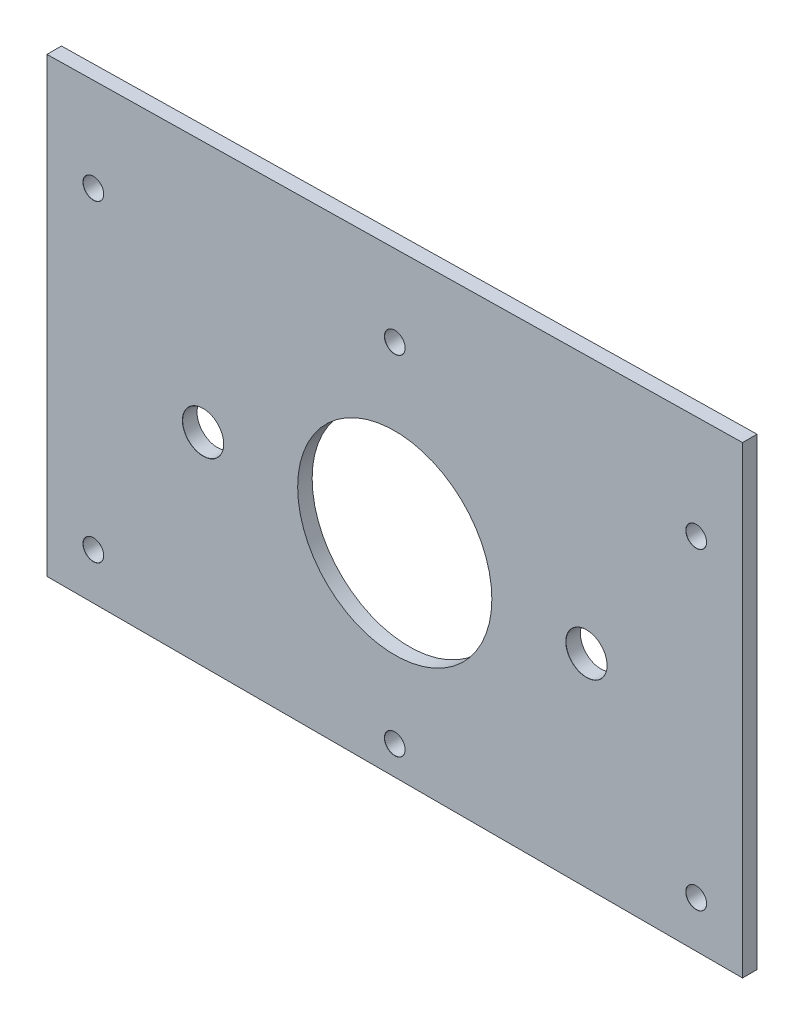
ISO-10303-21;
HEADER;
FILE_DESCRIPTION(('STEP AP214'),'2;1');
FILE_NAME('part.step','',(''),(''),'','','');
FILE_SCHEMA(('AUTOMOTIVE_DESIGN { 1 0 10303 214 1 1 1 1 }'));
ENDSEC;
DATA;
#1=APPLICATION_CONTEXT('core data for automotive mechanical design processes');
#2=APPLICATION_PROTOCOL_DEFINITION('international standard','automotive_design',2000,#1);
#3=PRODUCT_CONTEXT('',#1,'mechanical');
#4=PRODUCT('Part','Part','',(#3));
#5=PRODUCT_RELATED_PRODUCT_CATEGORY('part','',(#4));
#6=PRODUCT_DEFINITION_FORMATION('','',#4);
#7=PRODUCT_DEFINITION_CONTEXT('part definition',#1,'design');
#8=PRODUCT_DEFINITION('design','',#6,#7);
#9=PRODUCT_DEFINITION_SHAPE('','',#8);
#10=(LENGTH_UNIT() NAMED_UNIT(*) SI_UNIT(.MILLI.,.METRE.));
#11=(NAMED_UNIT(*) PLANE_ANGLE_UNIT() SI_UNIT($,.RADIAN.));
#12=(NAMED_UNIT(*) SI_UNIT($,.STERADIAN.) SOLID_ANGLE_UNIT());
#13=UNCERTAINTY_MEASURE_WITH_UNIT(LENGTH_MEASURE(1.E-05),#10,'distance_accuracy_value','');
#14=(GEOMETRIC_REPRESENTATION_CONTEXT(3) GLOBAL_UNCERTAINTY_ASSIGNED_CONTEXT((#13)) GLOBAL_UNIT_ASSIGNED_CONTEXT((#10,
#11,#12)) REPRESENTATION_CONTEXT('',''));
#15=CARTESIAN_POINT('',(0.,0.,0.));
#16=DIRECTION('',(0.,0.,1.));
#17=DIRECTION('',(1.,0.,0.));
#18=AXIS2_PLACEMENT_3D('',#15,#16,#17);
#19=CARTESIAN_POINT('',(76.2,44.45,3.175));
#20=DIRECTION('',(-1.,0.,0.));
#21=DIRECTION('',(0.,0.,1.));
#22=AXIS2_PLACEMENT_3D('',#19,#20,#21);
#23=PLANE('',#22);
#24=DIRECTION('',(0.,1.,0.));
#25=VECTOR('',#24,1.);
#26=CARTESIAN_POINT('',(76.2,44.45,0.));
#27=LINE('',#26,#25);
#28=CARTESIAN_POINT('',(76.2,-44.45,0.));
#29=VERTEX_POINT('',#28);
#30=CARTESIAN_POINT('',(76.2,57.15,0.));
#31=VERTEX_POINT('',#30);
#32=EDGE_CURVE('E74',#29,#31,#27,.T.);
#33=ORIENTED_EDGE('',*,*,#32,.T.);
#34=DIRECTION('',(0.,0.,-1.));
#35=VECTOR('',#34,1.);
#36=CARTESIAN_POINT('',(76.2,57.15,3.175));
#37=LINE('',#36,#35);
#38=CARTESIAN_POINT('',(76.2,57.15,3.175));
#39=VERTEX_POINT('',#38);
#40=EDGE_CURVE('E11',#39,#31,#37,.T.);
#41=ORIENTED_EDGE('',*,*,#40,.F.);
#42=DIRECTION('',(0.,1.,0.));
#43=VECTOR('',#42,1.);
#44=CARTESIAN_POINT('',(76.2,44.45,3.175));
#45=LINE('',#44,#43);
#46=CARTESIAN_POINT('',(76.2,-44.45,3.175));
#47=VERTEX_POINT('',#46);
#48=EDGE_CURVE('E79',#47,#39,#45,.T.);
#49=ORIENTED_EDGE('',*,*,#48,.F.);
#50=DIRECTION('',(0.,0.,-1.));
#51=VECTOR('',#50,1.);
#52=CARTESIAN_POINT('',(76.2,-44.45,3.175));
#53=LINE('',#52,#51);
#54=EDGE_CURVE('E95',#47,#29,#53,.T.);
#55=ORIENTED_EDGE('',*,*,#54,.T.);
#56=EDGE_LOOP('',(#33,#41,#49,#55));
#57=FACE_BOUND('',#56,.T.);
#58=ADVANCED_FACE('F35',(#57),#23,.F.);
#59=CARTESIAN_POINT('',(-76.2,54.61,3.175));
#60=DIRECTION('',(0.0166643523339933,-0.9998611400396,0.));
#61=DIRECTION('',(0.9998611400396,0.0166643523339933,0.));
#62=AXIS2_PLACEMENT_3D('',#59,#60,#61);
#63=PLANE('',#62);
#64=DIRECTION('',(-0.9998611400396,-0.0166643523339933,0.));
#65=VECTOR('',#64,1.);
#66=CARTESIAN_POINT('',(-76.2,54.61,0.));
#67=LINE('',#66,#65);
#68=CARTESIAN_POINT('',(-76.2,54.61,0.));
#69=VERTEX_POINT('',#68);
#70=EDGE_CURVE('E91',#31,#69,#67,.T.);
#71=ORIENTED_EDGE('',*,*,#70,.T.);
#72=DIRECTION('',(0.,0.,-1.));
#73=VECTOR('',#72,1.);
#74=CARTESIAN_POINT('',(-76.2,54.61,3.175));
#75=LINE('',#74,#73);
#76=CARTESIAN_POINT('',(-76.2,54.61,3.175));
#77=VERTEX_POINT('',#76);
#78=EDGE_CURVE('E43',#77,#69,#75,.T.);
#79=ORIENTED_EDGE('',*,*,#78,.F.);
#80=DIRECTION('',(-0.9998611400396,-0.0166643523339933,0.));
#81=VECTOR('',#80,1.);
#82=CARTESIAN_POINT('',(-76.2,54.61,3.175));
#83=LINE('',#82,#81);
#84=EDGE_CURVE('E82',#39,#77,#83,.T.);
#85=ORIENTED_EDGE('',*,*,#84,.F.);
#86=ORIENTED_EDGE('',*,*,#40,.T.);
#87=EDGE_LOOP('',(#71,#79,#85,#86));
#88=FACE_BOUND('',#87,.T.);
#89=ADVANCED_FACE('F90',(#88),#63,.F.);
#90=CARTESIAN_POINT('',(-76.2,44.45,3.175));
#91=DIRECTION('',(1.,0.,0.));
#92=DIRECTION('',(0.,0.,-1.));
#93=AXIS2_PLACEMENT_3D('',#90,#91,#92);
#94=PLANE('',#93);
#95=DIRECTION('',(0.,-1.,0.));
#96=VECTOR('',#95,1.);
#97=CARTESIAN_POINT('',(-76.2,44.45,0.));
#98=LINE('',#97,#96);
#99=CARTESIAN_POINT('',(-76.2,-44.45,0.));
#100=VERTEX_POINT('',#99);
#101=EDGE_CURVE('E67',#69,#100,#98,.T.);
#102=ORIENTED_EDGE('',*,*,#101,.T.);
#103=DIRECTION('',(0.,0.,-1.));
#104=VECTOR('',#103,1.);
#105=CARTESIAN_POINT('',(-76.2,-44.45,3.175));
#106=LINE('',#105,#104);
#107=CARTESIAN_POINT('',(-76.2,-44.45,3.175));
#108=VERTEX_POINT('',#107);
#109=EDGE_CURVE('E92',#108,#100,#106,.T.);
#110=ORIENTED_EDGE('',*,*,#109,.F.);
#111=DIRECTION('',(0.,-1.,0.));
#112=VECTOR('',#111,1.);
#113=CARTESIAN_POINT('',(-76.2,54.61,3.175));
#114=LINE('',#113,#112);
#115=EDGE_CURVE('E86',#77,#108,#114,.T.);
#116=ORIENTED_EDGE('',*,*,#115,.F.);
#117=ORIENTED_EDGE('',*,*,#78,.T.);
#118=EDGE_LOOP('',(#102,#110,#116,#117));
#119=FACE_BOUND('',#118,.T.);
#120=ADVANCED_FACE('F93',(#119),#94,.F.);
#121=CARTESIAN_POINT('',(-76.2,-44.45,3.175));
#122=DIRECTION('',(0.,1.,0.));
#123=DIRECTION('',(0.,0.,1.));
#124=AXIS2_PLACEMENT_3D('',#121,#122,#123);
#125=PLANE('',#124);
#126=DIRECTION('',(1.,0.,0.));
#127=VECTOR('',#126,1.);
#128=CARTESIAN_POINT('',(-76.2,-44.45,0.));
#129=LINE('',#128,#127);
#130=EDGE_CURVE('E103',#100,#29,#129,.T.);
#131=ORIENTED_EDGE('',*,*,#130,.T.);
#132=ORIENTED_EDGE('',*,*,#54,.F.);
#133=DIRECTION('',(1.,0.,0.));
#134=VECTOR('',#133,1.);
#135=CARTESIAN_POINT('',(-76.2,-44.45,3.175));
#136=LINE('',#135,#134);
#137=EDGE_CURVE('E51',#108,#47,#136,.T.);
#138=ORIENTED_EDGE('',*,*,#137,.F.);
#139=ORIENTED_EDGE('',*,*,#109,.T.);
#140=EDGE_LOOP('',(#131,#132,#138,#139));
#141=FACE_BOUND('',#140,.T.);
#142=ADVANCED_FACE('F108',(#141),#125,.F.);
#143=CARTESIAN_POINT('',(0.,0.,3.175));
#144=DIRECTION('',(0.,0.,1.));
#145=DIRECTION('',(1.,0.,0.));
#146=AXIS2_PLACEMENT_3D('',#143,#144,#145);
#147=PLANE('',#146);
#148=CARTESIAN_POINT('',(0.,0.,3.175));
#149=DIRECTION('',(0.,0.,1.));
#150=DIRECTION('',(1.,0.,0.));
#151=AXIS2_PLACEMENT_3D('',#148,#149,#150);
#152=CIRCLE('',#151,21.275);
#153=CARTESIAN_POINT('',(21.275,0.,3.175));
#154=VERTEX_POINT('',#153);
#155=EDGE_CURVE('E204',#154,#154,#152,.T.);
#156=ORIENTED_EDGE('',*,*,#155,.F.);
#157=EDGE_LOOP('',(#156));
#158=FACE_BOUND('',#157,.T.);
#159=CARTESIAN_POINT('',(-42.,0.,3.175));
#160=DIRECTION('',(0.,0.,1.));
#161=DIRECTION('',(1.,0.,0.));
#162=AXIS2_PLACEMENT_3D('',#159,#160,#161);
#163=CIRCLE('',#162,4.525);
#164=CARTESIAN_POINT('',(-37.475,0.,3.175));
#165=VERTEX_POINT('',#164);
#166=EDGE_CURVE('E200',#165,#165,#163,.T.);
#167=ORIENTED_EDGE('',*,*,#166,.F.);
#168=EDGE_LOOP('',(#167));
#169=FACE_BOUND('',#168,.T.);
#170=CARTESIAN_POINT('',(42.,0.,3.175));
#171=DIRECTION('',(0.,0.,1.));
#172=DIRECTION('',(1.,0.,0.));
#173=AXIS2_PLACEMENT_3D('',#170,#171,#172);
#174=CIRCLE('',#173,4.525);
#175=CARTESIAN_POINT('',(46.525,0.,3.175));
#176=VERTEX_POINT('',#175);
#177=EDGE_CURVE('E191',#176,#176,#174,.T.);
#178=ORIENTED_EDGE('',*,*,#177,.F.);
#179=EDGE_LOOP('',(#178));
#180=FACE_BOUND('',#179,.T.);
#181=CARTESIAN_POINT('',(-66.04,34.29,3.175));
#182=DIRECTION('',(0.,0.,1.));
#183=DIRECTION('',(1.,0.,0.));
#184=AXIS2_PLACEMENT_3D('',#181,#182,#183);
#185=CIRCLE('',#184,2.275);
#186=CARTESIAN_POINT('',(-63.765,34.29,3.175));
#187=VERTEX_POINT('',#186);
#188=EDGE_CURVE('E182',#187,#187,#185,.T.);
#189=ORIENTED_EDGE('',*,*,#188,.F.);
#190=EDGE_LOOP('',(#189));
#191=FACE_BOUND('',#190,.T.);
#192=CARTESIAN_POINT('',(-66.04,-34.29,3.175));
#193=DIRECTION('',(0.,0.,1.));
#194=DIRECTION('',(1.,0.,0.));
#195=AXIS2_PLACEMENT_3D('',#192,#193,#194);
#196=CIRCLE('',#195,2.275);
#197=CARTESIAN_POINT('',(-63.765,-34.29,3.175));
#198=VERTEX_POINT('',#197);
#199=EDGE_CURVE('E173',#198,#198,#196,.T.);
#200=ORIENTED_EDGE('',*,*,#199,.F.);
#201=EDGE_LOOP('',(#200));
#202=FACE_BOUND('',#201,.T.);
#203=CARTESIAN_POINT('',(0.,-38.1,3.175));
#204=DIRECTION('',(0.,0.,1.));
#205=DIRECTION('',(1.,0.,0.));
#206=AXIS2_PLACEMENT_3D('',#203,#204,#205);
#207=CIRCLE('',#206,2.275);
#208=CARTESIAN_POINT('',(2.27500000000003,-38.1,3.175));
#209=VERTEX_POINT('',#208);
#210=EDGE_CURVE('E164',#209,#209,#207,.T.);
#211=ORIENTED_EDGE('',*,*,#210,.F.);
#212=EDGE_LOOP('',(#211));
#213=FACE_BOUND('',#212,.T.);
#214=CARTESIAN_POINT('',(66.04,-34.29,3.175));
#215=DIRECTION('',(0.,0.,1.));
#216=DIRECTION('',(1.,0.,0.));
#217=AXIS2_PLACEMENT_3D('',#214,#215,#216);
#218=CIRCLE('',#217,2.275);
#219=CARTESIAN_POINT('',(68.315,-34.29,3.175));
#220=VERTEX_POINT('',#219);
#221=EDGE_CURVE('E155',#220,#220,#218,.T.);
#222=ORIENTED_EDGE('',*,*,#221,.F.);
#223=EDGE_LOOP('',(#222));
#224=FACE_BOUND('',#223,.T.);
#225=CARTESIAN_POINT('',(66.04,34.29,3.175));
#226=DIRECTION('',(0.,0.,1.));
#227=DIRECTION('',(1.,0.,0.));
#228=AXIS2_PLACEMENT_3D('',#225,#226,#227);
#229=CIRCLE('',#228,2.275);
#230=CARTESIAN_POINT('',(68.315,34.29,3.175));
#231=VERTEX_POINT('',#230);
#232=EDGE_CURVE('E146',#231,#231,#229,.T.);
#233=ORIENTED_EDGE('',*,*,#232,.F.);
#234=EDGE_LOOP('',(#233));
#235=FACE_BOUND('',#234,.T.);
#236=CARTESIAN_POINT('',(0.,38.1,3.175));
#237=DIRECTION('',(0.,0.,1.));
#238=DIRECTION('',(1.,0.,0.));
#239=AXIS2_PLACEMENT_3D('',#236,#237,#238);
#240=CIRCLE('',#239,2.275);
#241=CARTESIAN_POINT('',(2.27500000000003,38.1,3.175));
#242=VERTEX_POINT('',#241);
#243=EDGE_CURVE('E137',#242,#242,#240,.T.);
#244=ORIENTED_EDGE('',*,*,#243,.F.);
#245=EDGE_LOOP('',(#244));
#246=FACE_BOUND('',#245,.T.);
#247=ORIENTED_EDGE('',*,*,#48,.T.);
#248=ORIENTED_EDGE('',*,*,#84,.T.);
#249=ORIENTED_EDGE('',*,*,#115,.T.);
#250=ORIENTED_EDGE('',*,*,#137,.T.);
#251=EDGE_LOOP('',(#247,#248,#249,#250));
#252=FACE_BOUND('',#251,.T.);
#253=ADVANCED_FACE('F84',(#158,#169,#180,#191,#202,#213,#224,#235,#246,#252),#147,.T.);
#254=CARTESIAN_POINT('',(0.,0.,0.));
#255=DIRECTION('',(0.,0.,1.));
#256=DIRECTION('',(1.,0.,0.));
#257=AXIS2_PLACEMENT_3D('',#254,#255,#256);
#258=PLANE('',#257);
#259=CARTESIAN_POINT('',(0.,0.,0.));
#260=DIRECTION('',(0.,0.,1.));
#261=DIRECTION('',(1.,0.,0.));
#262=AXIS2_PLACEMENT_3D('',#259,#260,#261);
#263=CIRCLE('',#262,21.275);
#264=CARTESIAN_POINT('',(21.275,0.,0.));
#265=VERTEX_POINT('',#264);
#266=EDGE_CURVE('E203',#265,#265,#263,.T.);
#267=ORIENTED_EDGE('',*,*,#266,.T.);
#268=EDGE_LOOP('',(#267));
#269=FACE_BOUND('',#268,.T.);
#270=CARTESIAN_POINT('',(-42.,0.,0.));
#271=DIRECTION('',(0.,0.,1.));
#272=DIRECTION('',(1.,0.,0.));
#273=AXIS2_PLACEMENT_3D('',#270,#271,#272);
#274=CIRCLE('',#273,4.5);
#275=CARTESIAN_POINT('',(-37.5,0.,0.));
#276=VERTEX_POINT('',#275);
#277=EDGE_CURVE('E194',#276,#276,#274,.T.);
#278=ORIENTED_EDGE('',*,*,#277,.T.);
#279=EDGE_LOOP('',(#278));
#280=FACE_BOUND('',#279,.T.);
#281=CARTESIAN_POINT('',(42.,0.,0.));
#282=DIRECTION('',(0.,0.,1.));
#283=DIRECTION('',(1.,0.,0.));
#284=AXIS2_PLACEMENT_3D('',#281,#282,#283);
#285=CIRCLE('',#284,4.5);
#286=CARTESIAN_POINT('',(46.5,0.,0.));
#287=VERTEX_POINT('',#286);
#288=EDGE_CURVE('E185',#287,#287,#285,.T.);
#289=ORIENTED_EDGE('',*,*,#288,.T.);
#290=EDGE_LOOP('',(#289));
#291=FACE_BOUND('',#290,.T.);
#292=CARTESIAN_POINT('',(-66.04,34.29,0.));
#293=DIRECTION('',(0.,0.,1.));
#294=DIRECTION('',(1.,0.,0.));
#295=AXIS2_PLACEMENT_3D('',#292,#293,#294);
#296=CIRCLE('',#295,2.25);
#297=CARTESIAN_POINT('',(-63.79,34.29,0.));
#298=VERTEX_POINT('',#297);
#299=EDGE_CURVE('E176',#298,#298,#296,.T.);
#300=ORIENTED_EDGE('',*,*,#299,.T.);
#301=EDGE_LOOP('',(#300));
#302=FACE_BOUND('',#301,.T.);
#303=CARTESIAN_POINT('',(-66.04,-34.29,0.));
#304=DIRECTION('',(0.,0.,1.));
#305=DIRECTION('',(1.,0.,0.));
#306=AXIS2_PLACEMENT_3D('',#303,#304,#305);
#307=CIRCLE('',#306,2.25);
#308=CARTESIAN_POINT('',(-63.79,-34.29,0.));
#309=VERTEX_POINT('',#308);
#310=EDGE_CURVE('E167',#309,#309,#307,.T.);
#311=ORIENTED_EDGE('',*,*,#310,.T.);
#312=EDGE_LOOP('',(#311));
#313=FACE_BOUND('',#312,.T.);
#314=CARTESIAN_POINT('',(0.,-38.1,0.));
#315=DIRECTION('',(0.,0.,1.));
#316=DIRECTION('',(1.,0.,0.));
#317=AXIS2_PLACEMENT_3D('',#314,#315,#316);
#318=CIRCLE('',#317,2.25);
#319=CARTESIAN_POINT('',(2.25000000000003,-38.1,0.));
#320=VERTEX_POINT('',#319);
#321=EDGE_CURVE('E158',#320,#320,#318,.T.);
#322=ORIENTED_EDGE('',*,*,#321,.T.);
#323=EDGE_LOOP('',(#322));
#324=FACE_BOUND('',#323,.T.);
#325=CARTESIAN_POINT('',(66.04,-34.29,0.));
#326=DIRECTION('',(0.,0.,1.));
#327=DIRECTION('',(1.,0.,0.));
#328=AXIS2_PLACEMENT_3D('',#325,#326,#327);
#329=CIRCLE('',#328,2.25);
#330=CARTESIAN_POINT('',(68.29,-34.29,0.));
#331=VERTEX_POINT('',#330);
#332=EDGE_CURVE('E149',#331,#331,#329,.T.);
#333=ORIENTED_EDGE('',*,*,#332,.T.);
#334=EDGE_LOOP('',(#333));
#335=FACE_BOUND('',#334,.T.);
#336=CARTESIAN_POINT('',(66.04,34.29,0.));
#337=DIRECTION('',(0.,0.,1.));
#338=DIRECTION('',(1.,0.,0.));
#339=AXIS2_PLACEMENT_3D('',#336,#337,#338);
#340=CIRCLE('',#339,2.25);
#341=CARTESIAN_POINT('',(68.29,34.29,0.));
#342=VERTEX_POINT('',#341);
#343=EDGE_CURVE('E140',#342,#342,#340,.T.);
#344=ORIENTED_EDGE('',*,*,#343,.T.);
#345=EDGE_LOOP('',(#344));
#346=FACE_BOUND('',#345,.T.);
#347=CARTESIAN_POINT('',(0.,38.1,0.));
#348=DIRECTION('',(0.,0.,1.));
#349=DIRECTION('',(1.,0.,0.));
#350=AXIS2_PLACEMENT_3D('',#347,#348,#349);
#351=CIRCLE('',#350,2.25);
#352=CARTESIAN_POINT('',(2.25000000000003,38.1,0.));
#353=VERTEX_POINT('',#352);
#354=EDGE_CURVE('E100',#353,#353,#351,.T.);
#355=ORIENTED_EDGE('',*,*,#354,.T.);
#356=EDGE_LOOP('',(#355));
#357=FACE_BOUND('',#356,.T.);
#358=ORIENTED_EDGE('',*,*,#32,.F.);
#359=ORIENTED_EDGE('',*,*,#130,.F.);
#360=ORIENTED_EDGE('',*,*,#101,.F.);
#361=ORIENTED_EDGE('',*,*,#70,.F.);
#362=EDGE_LOOP('',(#358,#359,#360,#361));
#363=FACE_BOUND('',#362,.T.);
#364=ADVANCED_FACE('F109',(#269,#280,#291,#302,#313,#324,#335,#346,#357,#363),#258,.F.);
#365=CARTESIAN_POINT('',(0.,38.1,3.175));
#366=DIRECTION('',(0.,0.,1.));
#367=DIRECTION('',(1.,0.,0.));
#368=AXIS2_PLACEMENT_3D('',#365,#366,#367);
#369=CYLINDRICAL_SURFACE('',#368,2.25);
#370=ORIENTED_EDGE('',*,*,#354,.F.);
#371=EDGE_LOOP('',(#370));
#372=FACE_BOUND('',#371,.T.);
#373=CARTESIAN_POINT('',(0.,38.1,3.15));
#374=DIRECTION('',(0.,0.,1.));
#375=DIRECTION('',(1.,0.,0.));
#376=AXIS2_PLACEMENT_3D('',#373,#374,#375);
#377=CIRCLE('',#376,2.25);
#378=CARTESIAN_POINT('',(2.25000000000003,38.1,3.15));
#379=VERTEX_POINT('',#378);
#380=EDGE_CURVE('E134',#379,#379,#377,.T.);
#381=ORIENTED_EDGE('',*,*,#380,.T.);
#382=EDGE_LOOP('',(#381));
#383=FACE_BOUND('',#382,.T.);
#384=ADVANCED_FACE('F111',(#372,#383),#369,.F.);
#385=CARTESIAN_POINT('',(0.,38.1,3.175));
#386=DIRECTION('',(0.,0.,1.));
#387=DIRECTION('',(1.,0.,0.));
#388=AXIS2_PLACEMENT_3D('',#385,#386,#387);
#389=CONICAL_SURFACE('',#388,2.275,0.785398163397396);
#390=ORIENTED_EDGE('',*,*,#380,.F.);
#391=EDGE_LOOP('',(#390));
#392=FACE_BOUND('',#391,.T.);
#393=ORIENTED_EDGE('',*,*,#243,.T.);
#394=EDGE_LOOP('',(#393));
#395=FACE_BOUND('',#394,.T.);
#396=ADVANCED_FACE('F118',(#392,#395),#389,.F.);
#397=CARTESIAN_POINT('',(66.04,34.29,3.175));
#398=DIRECTION('',(0.,0.,1.));
#399=DIRECTION('',(1.,0.,0.));
#400=AXIS2_PLACEMENT_3D('',#397,#398,#399);
#401=CYLINDRICAL_SURFACE('',#400,2.25);
#402=ORIENTED_EDGE('',*,*,#343,.F.);
#403=EDGE_LOOP('',(#402));
#404=FACE_BOUND('',#403,.T.);
#405=CARTESIAN_POINT('',(66.04,34.29,3.15));
#406=DIRECTION('',(0.,0.,1.));
#407=DIRECTION('',(1.,0.,0.));
#408=AXIS2_PLACEMENT_3D('',#405,#406,#407);
#409=CIRCLE('',#408,2.25);
#410=CARTESIAN_POINT('',(68.29,34.29,3.15));
#411=VERTEX_POINT('',#410);
#412=EDGE_CURVE('E143',#411,#411,#409,.T.);
#413=ORIENTED_EDGE('',*,*,#412,.T.);
#414=EDGE_LOOP('',(#413));
#415=FACE_BOUND('',#414,.T.);
#416=ADVANCED_FACE('F233',(#404,#415),#401,.F.);
#417=CARTESIAN_POINT('',(66.04,34.29,3.175));
#418=DIRECTION('',(0.,0.,1.));
#419=DIRECTION('',(1.,0.,0.));
#420=AXIS2_PLACEMENT_3D('',#417,#418,#419);
#421=CONICAL_SURFACE('',#420,2.275,0.785398163397353);
#422=ORIENTED_EDGE('',*,*,#412,.F.);
#423=EDGE_LOOP('',(#422));
#424=FACE_BOUND('',#423,.T.);
#425=ORIENTED_EDGE('',*,*,#232,.T.);
#426=EDGE_LOOP('',(#425));
#427=FACE_BOUND('',#426,.T.);
#428=ADVANCED_FACE('F239',(#424,#427),#421,.F.);
#429=CARTESIAN_POINT('',(66.04,-34.29,3.175));
#430=DIRECTION('',(0.,0.,1.));
#431=DIRECTION('',(1.,0.,0.));
#432=AXIS2_PLACEMENT_3D('',#429,#430,#431);
#433=CYLINDRICAL_SURFACE('',#432,2.25);
#434=ORIENTED_EDGE('',*,*,#332,.F.);
#435=EDGE_LOOP('',(#434));
#436=FACE_BOUND('',#435,.T.);
#437=CARTESIAN_POINT('',(66.04,-34.29,3.15));
#438=DIRECTION('',(0.,0.,1.));
#439=DIRECTION('',(1.,0.,0.));
#440=AXIS2_PLACEMENT_3D('',#437,#438,#439);
#441=CIRCLE('',#440,2.25);
#442=CARTESIAN_POINT('',(68.29,-34.29,3.15));
#443=VERTEX_POINT('',#442);
#444=EDGE_CURVE('E152',#443,#443,#441,.T.);
#445=ORIENTED_EDGE('',*,*,#444,.T.);
#446=EDGE_LOOP('',(#445));
#447=FACE_BOUND('',#446,.T.);
#448=ADVANCED_FACE('F246',(#436,#447),#433,.F.);
#449=CARTESIAN_POINT('',(66.04,-34.29,3.175));
#450=DIRECTION('',(0.,0.,1.));
#451=DIRECTION('',(1.,0.,0.));
#452=AXIS2_PLACEMENT_3D('',#449,#450,#451);
#453=CONICAL_SURFACE('',#452,2.275,0.785398163397353);
#454=ORIENTED_EDGE('',*,*,#444,.F.);
#455=EDGE_LOOP('',(#454));
#456=FACE_BOUND('',#455,.T.);
#457=ORIENTED_EDGE('',*,*,#221,.T.);
#458=EDGE_LOOP('',(#457));
#459=FACE_BOUND('',#458,.T.);
#460=ADVANCED_FACE('F250',(#456,#459),#453,.F.);
#461=CARTESIAN_POINT('',(0.,-38.1,3.175));
#462=DIRECTION('',(0.,0.,1.));
#463=DIRECTION('',(1.,0.,0.));
#464=AXIS2_PLACEMENT_3D('',#461,#462,#463);
#465=CYLINDRICAL_SURFACE('',#464,2.25);
#466=ORIENTED_EDGE('',*,*,#321,.F.);
#467=EDGE_LOOP('',(#466));
#468=FACE_BOUND('',#467,.T.);
#469=CARTESIAN_POINT('',(0.,-38.1,3.15));
#470=DIRECTION('',(0.,0.,1.));
#471=DIRECTION('',(1.,0.,0.));
#472=AXIS2_PLACEMENT_3D('',#469,#470,#471);
#473=CIRCLE('',#472,2.25);
#474=CARTESIAN_POINT('',(2.25000000000003,-38.1,3.15));
#475=VERTEX_POINT('',#474);
#476=EDGE_CURVE('E161',#475,#475,#473,.T.);
#477=ORIENTED_EDGE('',*,*,#476,.T.);
#478=EDGE_LOOP('',(#477));
#479=FACE_BOUND('',#478,.T.);
#480=ADVANCED_FACE('F254',(#468,#479),#465,.F.);
#481=CARTESIAN_POINT('',(0.,-38.1,3.175));
#482=DIRECTION('',(0.,0.,1.));
#483=DIRECTION('',(1.,0.,0.));
#484=AXIS2_PLACEMENT_3D('',#481,#482,#483);
#485=CONICAL_SURFACE('',#484,2.275,0.785398163397396);
#486=ORIENTED_EDGE('',*,*,#476,.F.);
#487=EDGE_LOOP('',(#486));
#488=FACE_BOUND('',#487,.T.);
#489=ORIENTED_EDGE('',*,*,#210,.T.);
#490=EDGE_LOOP('',(#489));
#491=FACE_BOUND('',#490,.T.);
#492=ADVANCED_FACE('F258',(#488,#491),#485,.F.);
#493=CARTESIAN_POINT('',(-66.04,-34.29,3.175));
#494=DIRECTION('',(0.,0.,1.));
#495=DIRECTION('',(1.,0.,0.));
#496=AXIS2_PLACEMENT_3D('',#493,#494,#495);
#497=CYLINDRICAL_SURFACE('',#496,2.25);
#498=ORIENTED_EDGE('',*,*,#310,.F.);
#499=EDGE_LOOP('',(#498));
#500=FACE_BOUND('',#499,.T.);
#501=CARTESIAN_POINT('',(-66.04,-34.29,3.15));
#502=DIRECTION('',(0.,0.,1.));
#503=DIRECTION('',(1.,0.,0.));
#504=AXIS2_PLACEMENT_3D('',#501,#502,#503);
#505=CIRCLE('',#504,2.25);
#506=CARTESIAN_POINT('',(-63.79,-34.29,3.15));
#507=VERTEX_POINT('',#506);
#508=EDGE_CURVE('E170',#507,#507,#505,.T.);
#509=ORIENTED_EDGE('',*,*,#508,.T.);
#510=EDGE_LOOP('',(#509));
#511=FACE_BOUND('',#510,.T.);
#512=ADVANCED_FACE('F262',(#500,#511),#497,.F.);
#513=CARTESIAN_POINT('',(-66.04,-34.29,3.175));
#514=DIRECTION('',(0.,0.,1.));
#515=DIRECTION('',(1.,0.,0.));
#516=AXIS2_PLACEMENT_3D('',#513,#514,#515);
#517=CONICAL_SURFACE('',#516,2.275,0.785398163397353);
#518=ORIENTED_EDGE('',*,*,#508,.F.);
#519=EDGE_LOOP('',(#518));
#520=FACE_BOUND('',#519,.T.);
#521=ORIENTED_EDGE('',*,*,#199,.T.);
#522=EDGE_LOOP('',(#521));
#523=FACE_BOUND('',#522,.T.);
#524=ADVANCED_FACE('F266',(#520,#523),#517,.F.);
#525=CARTESIAN_POINT('',(-66.04,34.29,3.175));
#526=DIRECTION('',(0.,0.,1.));
#527=DIRECTION('',(1.,0.,0.));
#528=AXIS2_PLACEMENT_3D('',#525,#526,#527);
#529=CYLINDRICAL_SURFACE('',#528,2.25);
#530=ORIENTED_EDGE('',*,*,#299,.F.);
#531=EDGE_LOOP('',(#530));
#532=FACE_BOUND('',#531,.T.);
#533=CARTESIAN_POINT('',(-66.04,34.29,3.15));
#534=DIRECTION('',(0.,0.,1.));
#535=DIRECTION('',(1.,0.,0.));
#536=AXIS2_PLACEMENT_3D('',#533,#534,#535);
#537=CIRCLE('',#536,2.25);
#538=CARTESIAN_POINT('',(-63.79,34.29,3.15));
#539=VERTEX_POINT('',#538);
#540=EDGE_CURVE('E179',#539,#539,#537,.T.);
#541=ORIENTED_EDGE('',*,*,#540,.T.);
#542=EDGE_LOOP('',(#541));
#543=FACE_BOUND('',#542,.T.);
#544=ADVANCED_FACE('F270',(#532,#543),#529,.F.);
#545=CARTESIAN_POINT('',(-66.04,34.29,3.175));
#546=DIRECTION('',(0.,0.,1.));
#547=DIRECTION('',(1.,0.,0.));
#548=AXIS2_PLACEMENT_3D('',#545,#546,#547);
#549=CONICAL_SURFACE('',#548,2.275,0.785398163397353);
#550=ORIENTED_EDGE('',*,*,#540,.F.);
#551=EDGE_LOOP('',(#550));
#552=FACE_BOUND('',#551,.T.);
#553=ORIENTED_EDGE('',*,*,#188,.T.);
#554=EDGE_LOOP('',(#553));
#555=FACE_BOUND('',#554,.T.);
#556=ADVANCED_FACE('F274',(#552,#555),#549,.F.);
#557=CARTESIAN_POINT('',(42.,0.,3.175));
#558=DIRECTION('',(0.,0.,1.));
#559=DIRECTION('',(1.,0.,0.));
#560=AXIS2_PLACEMENT_3D('',#557,#558,#559);
#561=CYLINDRICAL_SURFACE('',#560,4.5);
#562=ORIENTED_EDGE('',*,*,#288,.F.);
#563=EDGE_LOOP('',(#562));
#564=FACE_BOUND('',#563,.T.);
#565=CARTESIAN_POINT('',(42.,0.,3.15));
#566=DIRECTION('',(0.,0.,1.));
#567=DIRECTION('',(1.,0.,0.));
#568=AXIS2_PLACEMENT_3D('',#565,#566,#567);
#569=CIRCLE('',#568,4.5);
#570=CARTESIAN_POINT('',(46.5,0.,3.15));
#571=VERTEX_POINT('',#570);
#572=EDGE_CURVE('E188',#571,#571,#569,.T.);
#573=ORIENTED_EDGE('',*,*,#572,.T.);
#574=EDGE_LOOP('',(#573));
#575=FACE_BOUND('',#574,.T.);
#576=ADVANCED_FACE('F278',(#564,#575),#561,.F.);
#577=CARTESIAN_POINT('',(42.,0.,3.175));
#578=DIRECTION('',(0.,0.,1.));
#579=DIRECTION('',(1.,0.,0.));
#580=AXIS2_PLACEMENT_3D('',#577,#578,#579);
#581=CONICAL_SURFACE('',#580,4.525,0.7853981633975);
#582=ORIENTED_EDGE('',*,*,#572,.F.);
#583=EDGE_LOOP('',(#582));
#584=FACE_BOUND('',#583,.T.);
#585=ORIENTED_EDGE('',*,*,#177,.T.);
#586=EDGE_LOOP('',(#585));
#587=FACE_BOUND('',#586,.T.);
#588=ADVANCED_FACE('F282',(#584,#587),#581,.F.);
#589=CARTESIAN_POINT('',(-42.,0.,3.175));
#590=DIRECTION('',(0.,0.,1.));
#591=DIRECTION('',(1.,0.,0.));
#592=AXIS2_PLACEMENT_3D('',#589,#590,#591);
#593=CYLINDRICAL_SURFACE('',#592,4.5);
#594=ORIENTED_EDGE('',*,*,#277,.F.);
#595=EDGE_LOOP('',(#594));
#596=FACE_BOUND('',#595,.T.);
#597=CARTESIAN_POINT('',(-42.,0.,3.15));
#598=DIRECTION('',(0.,0.,1.));
#599=DIRECTION('',(1.,0.,0.));
#600=AXIS2_PLACEMENT_3D('',#597,#598,#599);
#601=CIRCLE('',#600,4.5);
#602=CARTESIAN_POINT('',(-37.5,0.,3.15));
#603=VERTEX_POINT('',#602);
#604=EDGE_CURVE('E197',#603,#603,#601,.T.);
#605=ORIENTED_EDGE('',*,*,#604,.T.);
#606=EDGE_LOOP('',(#605));
#607=FACE_BOUND('',#606,.T.);
#608=ADVANCED_FACE('F286',(#596,#607),#593,.F.);
#609=CARTESIAN_POINT('',(-42.,0.,3.175));
#610=DIRECTION('',(0.,0.,1.));
#611=DIRECTION('',(1.,0.,0.));
#612=AXIS2_PLACEMENT_3D('',#609,#610,#611);
#613=CONICAL_SURFACE('',#612,4.525,0.7853981633975);
#614=ORIENTED_EDGE('',*,*,#604,.F.);
#615=EDGE_LOOP('',(#614));
#616=FACE_BOUND('',#615,.T.);
#617=ORIENTED_EDGE('',*,*,#166,.T.);
#618=EDGE_LOOP('',(#617));
#619=FACE_BOUND('',#618,.T.);
#620=ADVANCED_FACE('F212',(#616,#619),#613,.F.);
#621=CARTESIAN_POINT('',(0.,0.,0.));
#622=DIRECTION('',(0.,0.,1.));
#623=DIRECTION('',(1.,0.,0.));
#624=AXIS2_PLACEMENT_3D('',#621,#622,#623);
#625=CYLINDRICAL_SURFACE('',#624,21.275);
#626=ORIENTED_EDGE('',*,*,#266,.F.);
#627=EDGE_LOOP('',(#626));
#628=FACE_BOUND('',#627,.T.);
#629=ORIENTED_EDGE('',*,*,#155,.T.);
#630=EDGE_LOOP('',(#629));
#631=FACE_BOUND('',#630,.T.);
#632=ADVANCED_FACE('F209',(#628,#631),#625,.F.);
#633=CLOSED_SHELL('',(#58,#89,#120,#142,#253,#364,#384,#396,#416,#428,#448,#460,#480,#492,#512,
#524,#544,#556,#576,#588,#608,#620,#632));
#634=MANIFOLD_SOLID_BREP('B2',#633);
#635=ADVANCED_BREP_SHAPE_REPRESENTATION('',(#18,#634),#14);
#636=SHAPE_DEFINITION_REPRESENTATION(#9,#635);
ENDSEC;
END-ISO-10303-21;
